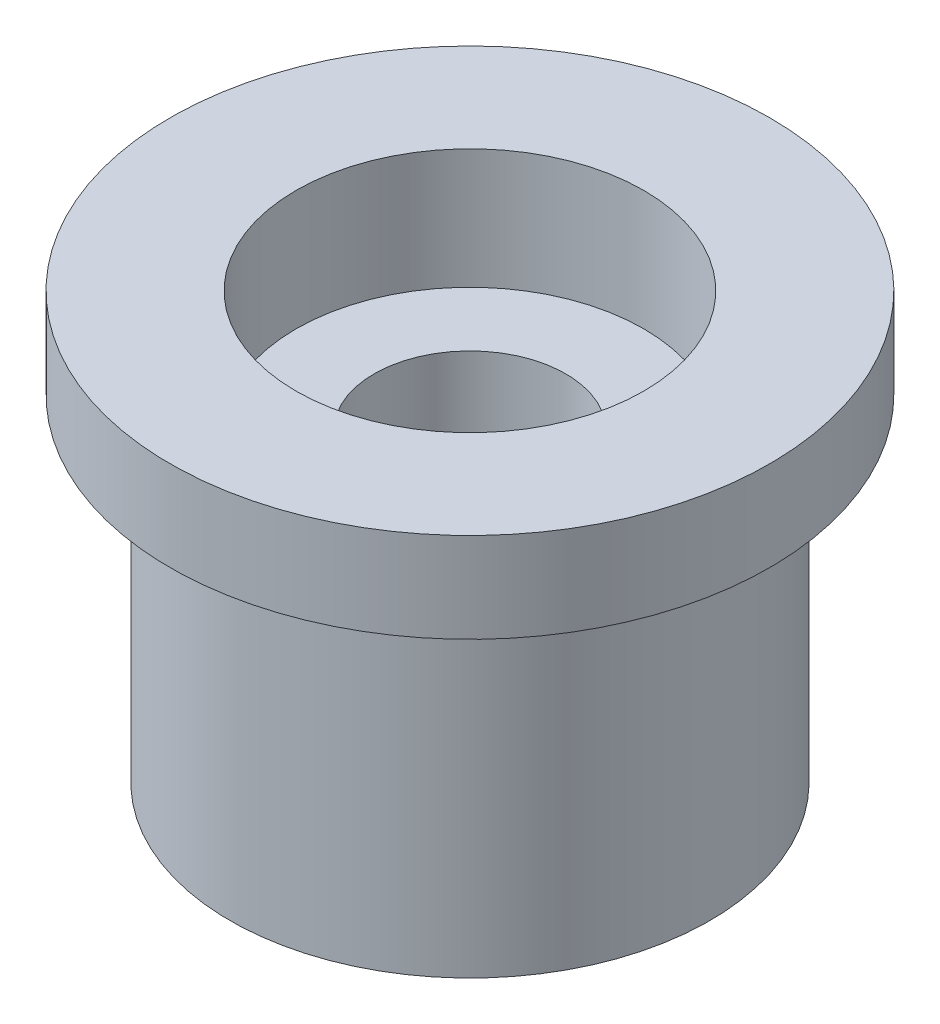
ISO-10303-21;
HEADER;
FILE_DESCRIPTION(('STEP AP214'),'2;1');
FILE_NAME('part.step','',(''),(''),'','','');
FILE_SCHEMA(('AUTOMOTIVE_DESIGN { 1 0 10303 214 1 1 1 1 }'));
ENDSEC;
DATA;
#1=APPLICATION_CONTEXT('core data for automotive mechanical design processes');
#2=APPLICATION_PROTOCOL_DEFINITION('international standard','automotive_design',2000,#1);
#3=PRODUCT_CONTEXT('',#1,'mechanical');
#4=PRODUCT('Part','Part','',(#3));
#5=PRODUCT_RELATED_PRODUCT_CATEGORY('part','',(#4));
#6=PRODUCT_DEFINITION_FORMATION('','',#4);
#7=PRODUCT_DEFINITION_CONTEXT('part definition',#1,'design');
#8=PRODUCT_DEFINITION('design','',#6,#7);
#9=PRODUCT_DEFINITION_SHAPE('','',#8);
#10=(LENGTH_UNIT() NAMED_UNIT(*) SI_UNIT(.MILLI.,.METRE.));
#11=(NAMED_UNIT(*) PLANE_ANGLE_UNIT() SI_UNIT($,.RADIAN.));
#12=(NAMED_UNIT(*) SI_UNIT($,.STERADIAN.) SOLID_ANGLE_UNIT());
#13=UNCERTAINTY_MEASURE_WITH_UNIT(LENGTH_MEASURE(1.E-05),#10,'distance_accuracy_value','');
#14=(GEOMETRIC_REPRESENTATION_CONTEXT(3) GLOBAL_UNCERTAINTY_ASSIGNED_CONTEXT((#13)) GLOBAL_UNIT_ASSIGNED_CONTEXT((#10,
#11,#12)) REPRESENTATION_CONTEXT('',''));
#15=CARTESIAN_POINT('',(0.,0.,0.));
#16=DIRECTION('',(0.,0.,1.));
#17=DIRECTION('',(1.,0.,0.));
#18=AXIS2_PLACEMENT_3D('',#15,#16,#17);
#19=CARTESIAN_POINT('',(0.,7.1,0.));
#20=DIRECTION('',(0.,-1.,0.));
#21=DIRECTION('',(0.,0.,-1.));
#22=AXIS2_PLACEMENT_3D('',#19,#20,#21);
#23=CYLINDRICAL_SURFACE('',#22,5.);
#24=CARTESIAN_POINT('',(0.,7.1,0.));
#25=DIRECTION('',(0.,-1.,0.));
#26=DIRECTION('',(0.,0.,-1.));
#27=AXIS2_PLACEMENT_3D('',#24,#25,#26);
#28=CIRCLE('',#27,5.);
#29=CARTESIAN_POINT('',(0.,7.1,-5.));
#30=VERTEX_POINT('',#29);
#31=EDGE_CURVE('E46',#30,#30,#28,.T.);
#32=ORIENTED_EDGE('',*,*,#31,.T.);
#33=EDGE_LOOP('',(#32));
#34=FACE_BOUND('',#33,.T.);
#35=CARTESIAN_POINT('',(0.,5.6,0.));
#36=DIRECTION('',(0.,-1.,0.));
#37=DIRECTION('',(0.,0.,-1.));
#38=AXIS2_PLACEMENT_3D('',#35,#36,#37);
#39=CIRCLE('',#38,5.);
#40=CARTESIAN_POINT('',(0.,5.6,-5.));
#41=VERTEX_POINT('',#40);
#42=EDGE_CURVE('E237',#41,#41,#39,.T.);
#43=ORIENTED_EDGE('',*,*,#42,.F.);
#44=EDGE_LOOP('',(#43));
#45=FACE_BOUND('',#44,.T.);
#46=ADVANCED_FACE('F43',(#34,#45),#23,.T.);
#47=CARTESIAN_POINT('',(5.,7.1,0.));
#48=DIRECTION('',(0.,1.,0.));
#49=DIRECTION('',(0.,0.,1.));
#50=AXIS2_PLACEMENT_3D('',#47,#48,#49);
#51=PLANE('',#50);
#52=CARTESIAN_POINT('',(0.,7.1,0.));
#53=DIRECTION('',(0.,1.,0.));
#54=DIRECTION('',(0.,0.,1.));
#55=AXIS2_PLACEMENT_3D('',#52,#53,#54);
#56=CIRCLE('',#55,2.9);
#57=CARTESIAN_POINT('',(0.,7.1,2.9));
#58=VERTEX_POINT('',#57);
#59=EDGE_CURVE('E337',#58,#58,#56,.T.);
#60=ORIENTED_EDGE('',*,*,#59,.F.);
#61=EDGE_LOOP('',(#60));
#62=FACE_BOUND('',#61,.T.);
#63=ORIENTED_EDGE('',*,*,#31,.F.);
#64=EDGE_LOOP('',(#63));
#65=FACE_BOUND('',#64,.T.);
#66=ADVANCED_FACE('F246',(#62,#65),#51,.T.);
#67=CARTESIAN_POINT('',(0.,5.6,0.));
#68=DIRECTION('',(0.,-1.,0.));
#69=DIRECTION('',(0.,0.,-1.));
#70=AXIS2_PLACEMENT_3D('',#67,#68,#69);
#71=PLANE('',#70);
#72=CARTESIAN_POINT('',(0.,5.6,0.));
#73=DIRECTION('',(0.,-1.,0.));
#74=DIRECTION('',(0.,0.,-1.));
#75=AXIS2_PLACEMENT_3D('',#72,#73,#74);
#76=CIRCLE('',#75,4.);
#77=CARTESIAN_POINT('',(0.,5.6,-4.));
#78=VERTEX_POINT('',#77);
#79=EDGE_CURVE('E11',#78,#78,#76,.T.);
#80=ORIENTED_EDGE('',*,*,#79,.F.);
#81=EDGE_LOOP('',(#80));
#82=FACE_BOUND('',#81,.T.);
#83=ORIENTED_EDGE('',*,*,#42,.T.);
#84=EDGE_LOOP('',(#83));
#85=FACE_BOUND('',#84,.T.);
#86=ADVANCED_FACE('F248',(#82,#85),#71,.T.);
#87=CARTESIAN_POINT('',(0.,0.,0.));
#88=DIRECTION('',(0.,1.,0.));
#89=DIRECTION('',(0.,0.,1.));
#90=AXIS2_PLACEMENT_3D('',#87,#88,#89);
#91=CYLINDRICAL_SURFACE('',#90,4.);
#92=CARTESIAN_POINT('',(0.,0.,0.));
#93=DIRECTION('',(0.,-1.,0.));
#94=DIRECTION('',(0.,0.,-1.));
#95=AXIS2_PLACEMENT_3D('',#92,#93,#94);
#96=CIRCLE('',#95,4.);
#97=CARTESIAN_POINT('',(0.,0.,-4.));
#98=VERTEX_POINT('',#97);
#99=EDGE_CURVE('E229',#98,#98,#96,.T.);
#100=ORIENTED_EDGE('',*,*,#99,.F.);
#101=EDGE_LOOP('',(#100));
#102=FACE_BOUND('',#101,.T.);
#103=ORIENTED_EDGE('',*,*,#79,.T.);
#104=EDGE_LOOP('',(#103));
#105=FACE_BOUND('',#104,.T.);
#106=ADVANCED_FACE('F254',(#102,#105),#91,.T.);
#107=CARTESIAN_POINT('',(0.,0.,0.));
#108=DIRECTION('',(0.,-1.,0.));
#109=DIRECTION('',(0.,0.,-1.));
#110=AXIS2_PLACEMENT_3D('',#107,#108,#109);
#111=PLANE('',#110);
#112=CARTESIAN_POINT('',(0.,0.,0.));
#113=DIRECTION('',(0.,1.,0.));
#114=DIRECTION('',(0.,0.,1.));
#115=AXIS2_PLACEMENT_3D('',#112,#113,#114);
#116=CIRCLE('',#115,1.60000000000001);
#117=CARTESIAN_POINT('',(0.,0.,1.60000000000001));
#118=VERTEX_POINT('',#117);
#119=EDGE_CURVE('E158',#118,#118,#116,.T.);
#120=ORIENTED_EDGE('',*,*,#119,.T.);
#121=EDGE_LOOP('',(#120));
#122=FACE_BOUND('',#121,.T.);
#123=CARTESIAN_POINT('',(-1.02515075142256E-13,0.,0.));
#124=DIRECTION('',(0.,-1.,0.));
#125=DIRECTION('',(0.,0.,-1.));
#126=AXIS2_PLACEMENT_3D('',#123,#124,#125);
#127=CIRCLE('',#126,3.09999999999998);
#128=CARTESIAN_POINT('',(-1.88345277640779,0.,2.46223590239489));
#129=VERTEX_POINT('',#128);
#130=CARTESIAN_POINT('',(-1.88345277640771,0.,-2.46223590239483));
#131=VERTEX_POINT('',#130);
#132=EDGE_CURVE('E58',#129,#131,#127,.T.);
#133=ORIENTED_EDGE('',*,*,#132,.F.);
#134=DIRECTION('',(-0.500000000000124,0.,0.866025403784367));
#135=VECTOR('',#134,1.);
#136=CARTESIAN_POINT('',(-1.47888532680438,0.,1.76150452459345));
#137=LINE('',#136,#135);
#138=CARTESIAN_POINT('',(-1.47888532680438,0.,1.76150452459345));
#139=VERTEX_POINT('',#138);
#140=EDGE_CURVE('E152',#139,#129,#137,.T.);
#141=ORIENTED_EDGE('',*,*,#140,.F.);
#142=CARTESIAN_POINT('',(-1.02515075142256E-13,0.,0.));
#143=DIRECTION('',(0.,1.,0.));
#144=DIRECTION('',(0.,0.,1.));
#145=AXIS2_PLACEMENT_3D('',#142,#143,#144);
#146=CIRCLE('',#145,2.3);
#147=CARTESIAN_POINT('',(-1.4788853268044,0.,-1.76150452459332));
#148=VERTEX_POINT('',#147);
#149=EDGE_CURVE('E155',#148,#139,#146,.T.);
#150=ORIENTED_EDGE('',*,*,#149,.F.);
#151=DIRECTION('',(0.5,0.,0.866025403784439));
#152=VECTOR('',#151,1.);
#153=CARTESIAN_POINT('',(-1.88345277640771,0.,-2.46223590239483));
#154=LINE('',#153,#152);
#155=EDGE_CURVE('E164',#131,#148,#154,.T.);
#156=ORIENTED_EDGE('',*,*,#155,.F.);
#157=EDGE_LOOP('',(#133,#141,#150,#156));
#158=FACE_BOUND('',#157,.T.);
#159=CARTESIAN_POINT('',(0.,0.,0.));
#160=DIRECTION('',(0.,1.,0.));
#161=DIRECTION('',(0.,0.,1.));
#162=AXIS2_PLACEMENT_3D('',#159,#160,#161);
#163=CIRCLE('',#162,2.3);
#164=CARTESIAN_POINT('',(2.26495033058122,0.,-0.400000000000019));
#165=VERTEX_POINT('',#164);
#166=CARTESIAN_POINT('',(-0.786065003776926,0.,-2.16150452459327));
#167=VERTEX_POINT('',#166);
#168=EDGE_CURVE('E66',#165,#167,#163,.T.);
#169=ORIENTED_EDGE('',*,*,#168,.F.);
#170=DIRECTION('',(-1.,0.,0.));
#171=VECTOR('',#170,1.);
#172=CARTESIAN_POINT('',(3.07408522978788,0.,-0.399999999999992));
#173=LINE('',#172,#171);
#174=CARTESIAN_POINT('',(3.07408522978788,0.,-0.399999999999993));
#175=VERTEX_POINT('',#174);
#176=EDGE_CURVE('E177',#175,#165,#173,.T.);
#177=ORIENTED_EDGE('',*,*,#176,.F.);
#178=CARTESIAN_POINT('',(0.,0.,0.));
#179=DIRECTION('',(0.,-1.,0.));
#180=DIRECTION('',(0.,0.,-1.));
#181=AXIS2_PLACEMENT_3D('',#178,#179,#180);
#182=CIRCLE('',#181,3.1);
#183=CARTESIAN_POINT('',(-1.19063245338013,0.,-2.86223590239484));
#184=VERTEX_POINT('',#183);
#185=EDGE_CURVE('E191',#184,#175,#182,.T.);
#186=ORIENTED_EDGE('',*,*,#185,.F.);
#187=DIRECTION('',(-0.499999999999857,0.,-0.866025403784521));
#188=VECTOR('',#187,1.);
#189=CARTESIAN_POINT('',(-0.786065003776927,0.,-2.16150452459327));
#190=LINE('',#189,#188);
#191=EDGE_CURVE('E188',#167,#184,#190,.T.);
#192=ORIENTED_EDGE('',*,*,#191,.F.);
#193=EDGE_LOOP('',(#169,#177,#186,#192));
#194=FACE_BOUND('',#193,.T.);
#195=CARTESIAN_POINT('',(0.,0.,0.));
#196=DIRECTION('',(0.,-1.,0.));
#197=DIRECTION('',(0.,0.,-1.));
#198=AXIS2_PLACEMENT_3D('',#195,#196,#197);
#199=CIRCLE('',#198,3.1);
#200=CARTESIAN_POINT('',(3.07408522978788,0.,0.399999999999992));
#201=VERTEX_POINT('',#200);
#202=CARTESIAN_POINT('',(-1.19063245337983,0.,2.86223590239497));
#203=VERTEX_POINT('',#202);
#204=EDGE_CURVE('E198',#201,#203,#199,.T.);
#205=ORIENTED_EDGE('',*,*,#204,.F.);
#206=DIRECTION('',(1.,0.,0.));
#207=VECTOR('',#206,1.);
#208=CARTESIAN_POINT('',(2.26495033058122,0.,0.400000000000019));
#209=LINE('',#208,#207);
#210=CARTESIAN_POINT('',(2.26495033058122,0.,0.40000000000002));
#211=VERTEX_POINT('',#210);
#212=EDGE_CURVE('E208',#211,#201,#209,.T.);
#213=ORIENTED_EDGE('',*,*,#212,.F.);
#214=CARTESIAN_POINT('',(0.,0.,0.));
#215=DIRECTION('',(0.,1.,0.));
#216=DIRECTION('',(0.,0.,1.));
#217=AXIS2_PLACEMENT_3D('',#214,#215,#216);
#218=CIRCLE('',#217,2.3);
#219=CARTESIAN_POINT('',(-0.786065003776618,0.,2.16150452459338));
#220=VERTEX_POINT('',#219);
#221=EDGE_CURVE('E222',#220,#211,#218,.T.);
#222=ORIENTED_EDGE('',*,*,#221,.F.);
#223=DIRECTION('',(0.499999999999856,0.,-0.866025403784522));
#224=VECTOR('',#223,1.);
#225=CARTESIAN_POINT('',(-1.19063245337983,0.,2.86223590239497));
#226=LINE('',#225,#224);
#227=EDGE_CURVE('E219',#203,#220,#226,.T.);
#228=ORIENTED_EDGE('',*,*,#227,.F.);
#229=EDGE_LOOP('',(#205,#213,#222,#228));
#230=FACE_BOUND('',#229,.T.);
#231=ORIENTED_EDGE('',*,*,#99,.T.);
#232=EDGE_LOOP('',(#231));
#233=FACE_BOUND('',#232,.T.);
#234=ADVANCED_FACE('F261',(#122,#158,#194,#230,#233),#111,.T.);
#235=CARTESIAN_POINT('',(0.,4.3,0.));
#236=DIRECTION('',(0.,-1.,0.));
#237=DIRECTION('',(0.,0.,-1.));
#238=AXIS2_PLACEMENT_3D('',#235,#236,#237);
#239=CYLINDRICAL_SURFACE('',#238,3.1);
#240=ORIENTED_EDGE('',*,*,#204,.T.);
#241=DIRECTION('',(0.,-1.,0.));
#242=VECTOR('',#241,1.);
#243=CARTESIAN_POINT('',(-1.19063245337983,4.3,2.86223590239497));
#244=LINE('',#243,#242);
#245=CARTESIAN_POINT('',(-1.19063245337983,4.3,2.86223590239497));
#246=VERTEX_POINT('',#245);
#247=EDGE_CURVE('E217',#246,#203,#244,.T.);
#248=ORIENTED_EDGE('',*,*,#247,.F.);
#249=CARTESIAN_POINT('',(0.,4.3,0.));
#250=DIRECTION('',(0.,-1.,0.));
#251=DIRECTION('',(0.,0.,-1.));
#252=AXIS2_PLACEMENT_3D('',#249,#250,#251);
#253=CIRCLE('',#252,3.1);
#254=CARTESIAN_POINT('',(3.07408522978788,4.3,0.399999999999992));
#255=VERTEX_POINT('',#254);
#256=EDGE_CURVE('E204',#255,#246,#253,.T.);
#257=ORIENTED_EDGE('',*,*,#256,.F.);
#258=DIRECTION('',(0.,-1.,0.));
#259=VECTOR('',#258,1.);
#260=CARTESIAN_POINT('',(3.07408522978788,4.3,0.399999999999992));
#261=LINE('',#260,#259);
#262=EDGE_CURVE('E227',#255,#201,#261,.T.);
#263=ORIENTED_EDGE('',*,*,#262,.T.);
#264=EDGE_LOOP('',(#240,#248,#257,#263));
#265=FACE_BOUND('',#264,.T.);
#266=ADVANCED_FACE('F265',(#265),#239,.F.);
#267=CARTESIAN_POINT('',(2.26495033058122,4.3,0.400000000000019));
#268=DIRECTION('',(0.,0.,-1.));
#269=DIRECTION('',(-1.,0.,0.));
#270=AXIS2_PLACEMENT_3D('',#267,#268,#269);
#271=PLANE('',#270);
#272=ORIENTED_EDGE('',*,*,#212,.T.);
#273=ORIENTED_EDGE('',*,*,#262,.F.);
#274=DIRECTION('',(1.,0.,0.));
#275=VECTOR('',#274,1.);
#276=CARTESIAN_POINT('',(2.26495033058122,4.3,0.400000000000019));
#277=LINE('',#276,#275);
#278=CARTESIAN_POINT('',(2.26495033058122,4.3,0.40000000000002));
#279=VERTEX_POINT('',#278);
#280=EDGE_CURVE('E214',#279,#255,#277,.T.);
#281=ORIENTED_EDGE('',*,*,#280,.F.);
#282=DIRECTION('',(0.,-1.,0.));
#283=VECTOR('',#282,1.);
#284=CARTESIAN_POINT('',(2.26495033058122,4.3,0.40000000000002));
#285=LINE('',#284,#283);
#286=EDGE_CURVE('E230',#279,#211,#285,.T.);
#287=ORIENTED_EDGE('',*,*,#286,.T.);
#288=EDGE_LOOP('',(#272,#273,#281,#287));
#289=FACE_BOUND('',#288,.T.);
#290=ADVANCED_FACE('F269',(#289),#271,.F.);
#291=CARTESIAN_POINT('',(0.,4.3,0.));
#292=DIRECTION('',(0.,-1.,0.));
#293=DIRECTION('',(0.,0.,-1.));
#294=AXIS2_PLACEMENT_3D('',#291,#292,#293);
#295=CYLINDRICAL_SURFACE('',#294,2.3);
#296=ORIENTED_EDGE('',*,*,#221,.T.);
#297=ORIENTED_EDGE('',*,*,#286,.F.);
#298=CARTESIAN_POINT('',(0.,4.3,0.));
#299=DIRECTION('',(0.,1.,0.));
#300=DIRECTION('',(0.,0.,1.));
#301=AXIS2_PLACEMENT_3D('',#298,#299,#300);
#302=CIRCLE('',#301,2.3);
#303=CARTESIAN_POINT('',(-0.786065003776618,4.3,2.16150452459338));
#304=VERTEX_POINT('',#303);
#305=EDGE_CURVE('E211',#304,#279,#302,.T.);
#306=ORIENTED_EDGE('',*,*,#305,.F.);
#307=DIRECTION('',(0.,-1.,0.));
#308=VECTOR('',#307,1.);
#309=CARTESIAN_POINT('',(-0.786065003776618,4.3,2.16150452459338));
#310=LINE('',#309,#308);
#311=EDGE_CURVE('E232',#304,#220,#310,.T.);
#312=ORIENTED_EDGE('',*,*,#311,.T.);
#313=EDGE_LOOP('',(#296,#297,#306,#312));
#314=FACE_BOUND('',#313,.T.);
#315=ADVANCED_FACE('F275',(#314),#295,.T.);
#316=CARTESIAN_POINT('',(-1.19063245337983,4.3,2.86223590239497));
#317=DIRECTION('',(-0.866025403784522,0.,-0.499999999999856));
#318=DIRECTION('',(-0.499999999999856,0.,0.866025403784522));
#319=AXIS2_PLACEMENT_3D('',#316,#317,#318);
#320=PLANE('',#319);
#321=ORIENTED_EDGE('',*,*,#227,.T.);
#322=ORIENTED_EDGE('',*,*,#311,.F.);
#323=DIRECTION('',(0.499999999999856,0.,-0.866025403784522));
#324=VECTOR('',#323,1.);
#325=CARTESIAN_POINT('',(-1.19063245337983,4.3,2.86223590239497));
#326=LINE('',#325,#324);
#327=EDGE_CURVE('E207',#246,#304,#326,.T.);
#328=ORIENTED_EDGE('',*,*,#327,.F.);
#329=ORIENTED_EDGE('',*,*,#247,.T.);
#330=EDGE_LOOP('',(#321,#322,#328,#329));
#331=FACE_BOUND('',#330,.T.);
#332=ADVANCED_FACE('F271',(#331),#320,.F.);
#333=CARTESIAN_POINT('',(0.,4.3,0.));
#334=DIRECTION('',(0.,-1.,0.));
#335=DIRECTION('',(0.,0.,-1.));
#336=AXIS2_PLACEMENT_3D('',#333,#334,#335);
#337=PLANE('',#336);
#338=ORIENTED_EDGE('',*,*,#256,.T.);
#339=ORIENTED_EDGE('',*,*,#327,.T.);
#340=ORIENTED_EDGE('',*,*,#305,.T.);
#341=ORIENTED_EDGE('',*,*,#280,.T.);
#342=EDGE_LOOP('',(#338,#339,#340,#341));
#343=FACE_BOUND('',#342,.T.);
#344=ADVANCED_FACE('F274',(#343),#337,.T.);
#345=CARTESIAN_POINT('',(0.,4.3,0.));
#346=DIRECTION('',(0.,-1.,0.));
#347=DIRECTION('',(0.,0.,-1.));
#348=AXIS2_PLACEMENT_3D('',#345,#346,#347);
#349=CYLINDRICAL_SURFACE('',#348,2.3);
#350=ORIENTED_EDGE('',*,*,#168,.T.);
#351=DIRECTION('',(0.,-1.,0.));
#352=VECTOR('',#351,1.);
#353=CARTESIAN_POINT('',(-0.786065003776927,4.3,-2.16150452459327));
#354=LINE('',#353,#352);
#355=CARTESIAN_POINT('',(-0.786065003776927,4.3,-2.16150452459327));
#356=VERTEX_POINT('',#355);
#357=EDGE_CURVE('E186',#356,#167,#354,.T.);
#358=ORIENTED_EDGE('',*,*,#357,.F.);
#359=CARTESIAN_POINT('',(0.,4.3,0.));
#360=DIRECTION('',(0.,1.,0.));
#361=DIRECTION('',(0.,0.,1.));
#362=AXIS2_PLACEMENT_3D('',#359,#360,#361);
#363=CIRCLE('',#362,2.3);
#364=CARTESIAN_POINT('',(2.26495033058122,4.3,-0.400000000000019));
#365=VERTEX_POINT('',#364);
#366=EDGE_CURVE('E173',#365,#356,#363,.T.);
#367=ORIENTED_EDGE('',*,*,#366,.F.);
#368=DIRECTION('',(0.,-1.,0.));
#369=VECTOR('',#368,1.);
#370=CARTESIAN_POINT('',(2.26495033058122,4.3,-0.400000000000019));
#371=LINE('',#370,#369);
#372=EDGE_CURVE('E196',#365,#165,#371,.T.);
#373=ORIENTED_EDGE('',*,*,#372,.T.);
#374=EDGE_LOOP('',(#350,#358,#367,#373));
#375=FACE_BOUND('',#374,.T.);
#376=ADVANCED_FACE('F285',(#375),#349,.T.);
#377=CARTESIAN_POINT('',(3.07408522978788,4.3,-0.399999999999992));
#378=DIRECTION('',(0.,0.,1.));
#379=DIRECTION('',(1.,0.,0.));
#380=AXIS2_PLACEMENT_3D('',#377,#378,#379);
#381=PLANE('',#380);
#382=ORIENTED_EDGE('',*,*,#176,.T.);
#383=ORIENTED_EDGE('',*,*,#372,.F.);
#384=DIRECTION('',(-1.,0.,0.));
#385=VECTOR('',#384,1.);
#386=CARTESIAN_POINT('',(3.07408522978788,4.3,-0.399999999999992));
#387=LINE('',#386,#385);
#388=CARTESIAN_POINT('',(3.07408522978788,4.3,-0.399999999999993));
#389=VERTEX_POINT('',#388);
#390=EDGE_CURVE('E183',#389,#365,#387,.T.);
#391=ORIENTED_EDGE('',*,*,#390,.F.);
#392=DIRECTION('',(0.,-1.,0.));
#393=VECTOR('',#392,1.);
#394=CARTESIAN_POINT('',(3.07408522978788,4.3,-0.399999999999993));
#395=LINE('',#394,#393);
#396=EDGE_CURVE('E199',#389,#175,#395,.T.);
#397=ORIENTED_EDGE('',*,*,#396,.T.);
#398=EDGE_LOOP('',(#382,#383,#391,#397));
#399=FACE_BOUND('',#398,.T.);
#400=ADVANCED_FACE('F289',(#399),#381,.F.);
#401=CARTESIAN_POINT('',(0.,4.3,0.));
#402=DIRECTION('',(0.,-1.,0.));
#403=DIRECTION('',(0.,0.,-1.));
#404=AXIS2_PLACEMENT_3D('',#401,#402,#403);
#405=CYLINDRICAL_SURFACE('',#404,3.1);
#406=ORIENTED_EDGE('',*,*,#185,.T.);
#407=ORIENTED_EDGE('',*,*,#396,.F.);
#408=CARTESIAN_POINT('',(0.,4.3,0.));
#409=DIRECTION('',(0.,-1.,0.));
#410=DIRECTION('',(0.,0.,-1.));
#411=AXIS2_PLACEMENT_3D('',#408,#409,#410);
#412=CIRCLE('',#411,3.1);
#413=CARTESIAN_POINT('',(-1.19063245338013,4.3,-2.86223590239484));
#414=VERTEX_POINT('',#413);
#415=EDGE_CURVE('E180',#414,#389,#412,.T.);
#416=ORIENTED_EDGE('',*,*,#415,.F.);
#417=DIRECTION('',(0.,-1.,0.));
#418=VECTOR('',#417,1.);
#419=CARTESIAN_POINT('',(-1.19063245338013,4.3,-2.86223590239484));
#420=LINE('',#419,#418);
#421=EDGE_CURVE('E201',#414,#184,#420,.T.);
#422=ORIENTED_EDGE('',*,*,#421,.T.);
#423=EDGE_LOOP('',(#406,#407,#416,#422));
#424=FACE_BOUND('',#423,.T.);
#425=ADVANCED_FACE('F294',(#424),#405,.F.);
#426=CARTESIAN_POINT('',(-0.786065003776927,4.3,-2.16150452459327));
#427=DIRECTION('',(-0.866025403784521,0.,0.499999999999857));
#428=DIRECTION('',(0.499999999999857,0.,0.866025403784521));
#429=AXIS2_PLACEMENT_3D('',#426,#427,#428);
#430=PLANE('',#429);
#431=ORIENTED_EDGE('',*,*,#191,.T.);
#432=ORIENTED_EDGE('',*,*,#421,.F.);
#433=DIRECTION('',(-0.499999999999857,0.,-0.866025403784521));
#434=VECTOR('',#433,1.);
#435=CARTESIAN_POINT('',(-0.786065003776927,4.3,-2.16150452459327));
#436=LINE('',#435,#434);
#437=EDGE_CURVE('E176',#356,#414,#436,.T.);
#438=ORIENTED_EDGE('',*,*,#437,.F.);
#439=ORIENTED_EDGE('',*,*,#357,.T.);
#440=EDGE_LOOP('',(#431,#432,#438,#439));
#441=FACE_BOUND('',#440,.T.);
#442=ADVANCED_FACE('F290',(#441),#430,.F.);
#443=CARTESIAN_POINT('',(0.,4.3,0.));
#444=DIRECTION('',(0.,1.,0.));
#445=DIRECTION('',(0.,0.,1.));
#446=AXIS2_PLACEMENT_3D('',#443,#444,#445);
#447=PLANE('',#446);
#448=ORIENTED_EDGE('',*,*,#366,.T.);
#449=ORIENTED_EDGE('',*,*,#437,.T.);
#450=ORIENTED_EDGE('',*,*,#415,.T.);
#451=ORIENTED_EDGE('',*,*,#390,.T.);
#452=EDGE_LOOP('',(#448,#449,#450,#451));
#453=FACE_BOUND('',#452,.T.);
#454=ADVANCED_FACE('F293',(#453),#447,.F.);
#455=CARTESIAN_POINT('',(-1.02515075142256E-13,4.3,0.));
#456=DIRECTION('',(0.,-1.,0.));
#457=DIRECTION('',(0.,0.,-1.));
#458=AXIS2_PLACEMENT_3D('',#455,#456,#457);
#459=CYLINDRICAL_SURFACE('',#458,3.09999999999998);
#460=ORIENTED_EDGE('',*,*,#132,.T.);
#461=DIRECTION('',(0.,-1.,0.));
#462=VECTOR('',#461,1.);
#463=CARTESIAN_POINT('',(-1.88345277640771,4.3,-2.46223590239483));
#464=LINE('',#463,#462);
#465=CARTESIAN_POINT('',(-1.88345277640771,4.3,-2.46223590239483));
#466=VERTEX_POINT('',#465);
#467=EDGE_CURVE('E130',#466,#131,#464,.T.);
#468=ORIENTED_EDGE('',*,*,#467,.F.);
#469=CARTESIAN_POINT('',(-1.02515075142256E-13,4.3,0.));
#470=DIRECTION('',(0.,-1.,0.));
#471=DIRECTION('',(0.,0.,-1.));
#472=AXIS2_PLACEMENT_3D('',#469,#470,#471);
#473=CIRCLE('',#472,3.09999999999998);
#474=CARTESIAN_POINT('',(-1.88345277640779,4.3,2.46223590239489));
#475=VERTEX_POINT('',#474);
#476=EDGE_CURVE('E134',#475,#466,#473,.T.);
#477=ORIENTED_EDGE('',*,*,#476,.F.);
#478=DIRECTION('',(0.,-1.,0.));
#479=VECTOR('',#478,1.);
#480=CARTESIAN_POINT('',(-1.88345277640779,4.3,2.46223590239489));
#481=LINE('',#480,#479);
#482=EDGE_CURVE('E168',#475,#129,#481,.T.);
#483=ORIENTED_EDGE('',*,*,#482,.T.);
#484=EDGE_LOOP('',(#460,#468,#477,#483));
#485=FACE_BOUND('',#484,.T.);
#486=ADVANCED_FACE('F132',(#485),#459,.F.);
#487=CARTESIAN_POINT('',(-1.47888532680438,4.3,1.76150452459345));
#488=DIRECTION('',(0.866025403784367,0.,0.500000000000124));
#489=DIRECTION('',(0.500000000000124,0.,-0.866025403784367));
#490=AXIS2_PLACEMENT_3D('',#487,#488,#489);
#491=PLANE('',#490);
#492=ORIENTED_EDGE('',*,*,#140,.T.);
#493=ORIENTED_EDGE('',*,*,#482,.F.);
#494=DIRECTION('',(-0.500000000000124,0.,0.866025403784367));
#495=VECTOR('',#494,1.);
#496=CARTESIAN_POINT('',(-1.47888532680438,4.3,1.76150452459345));
#497=LINE('',#496,#495);
#498=CARTESIAN_POINT('',(-1.47888532680438,4.3,1.76150452459345));
#499=VERTEX_POINT('',#498);
#500=EDGE_CURVE('E140',#499,#475,#497,.T.);
#501=ORIENTED_EDGE('',*,*,#500,.F.);
#502=DIRECTION('',(0.,-1.,0.));
#503=VECTOR('',#502,1.);
#504=CARTESIAN_POINT('',(-1.47888532680438,4.3,1.76150452459345));
#505=LINE('',#504,#503);
#506=EDGE_CURVE('E170',#499,#139,#505,.T.);
#507=ORIENTED_EDGE('',*,*,#506,.T.);
#508=EDGE_LOOP('',(#492,#493,#501,#507));
#509=FACE_BOUND('',#508,.T.);
#510=ADVANCED_FACE('F307',(#509),#491,.F.);
#511=CARTESIAN_POINT('',(-1.02515075142256E-13,4.3,0.));
#512=DIRECTION('',(0.,-1.,0.));
#513=DIRECTION('',(0.,0.,-1.));
#514=AXIS2_PLACEMENT_3D('',#511,#512,#513);
#515=CYLINDRICAL_SURFACE('',#514,2.3);
#516=ORIENTED_EDGE('',*,*,#149,.T.);
#517=ORIENTED_EDGE('',*,*,#506,.F.);
#518=CARTESIAN_POINT('',(-1.02515075142256E-13,4.3,0.));
#519=DIRECTION('',(0.,1.,0.));
#520=DIRECTION('',(0.,0.,1.));
#521=AXIS2_PLACEMENT_3D('',#518,#519,#520);
#522=CIRCLE('',#521,2.3);
#523=CARTESIAN_POINT('',(-1.4788853268044,4.3,-1.76150452459332));
#524=VERTEX_POINT('',#523);
#525=EDGE_CURVE('E148',#524,#499,#522,.T.);
#526=ORIENTED_EDGE('',*,*,#525,.F.);
#527=DIRECTION('',(0.,-1.,0.));
#528=VECTOR('',#527,1.);
#529=CARTESIAN_POINT('',(-1.4788853268044,4.3,-1.76150452459332));
#530=LINE('',#529,#528);
#531=EDGE_CURVE('E139',#524,#148,#530,.T.);
#532=ORIENTED_EDGE('',*,*,#531,.T.);
#533=EDGE_LOOP('',(#516,#517,#526,#532));
#534=FACE_BOUND('',#533,.T.);
#535=ADVANCED_FACE('F310',(#534),#515,.T.);
#536=CARTESIAN_POINT('',(-1.88345277640771,4.3,-2.46223590239483));
#537=DIRECTION('',(0.866025403784438,0.,-0.5));
#538=DIRECTION('',(-0.5,0.,-0.866025403784439));
#539=AXIS2_PLACEMENT_3D('',#536,#537,#538);
#540=PLANE('',#539);
#541=ORIENTED_EDGE('',*,*,#155,.T.);
#542=ORIENTED_EDGE('',*,*,#531,.F.);
#543=DIRECTION('',(0.5,0.,0.866025403784439));
#544=VECTOR('',#543,1.);
#545=CARTESIAN_POINT('',(-1.88345277640771,4.3,-2.46223590239483));
#546=LINE('',#545,#544);
#547=EDGE_CURVE('E143',#466,#524,#546,.T.);
#548=ORIENTED_EDGE('',*,*,#547,.F.);
#549=ORIENTED_EDGE('',*,*,#467,.T.);
#550=EDGE_LOOP('',(#541,#542,#548,#549));
#551=FACE_BOUND('',#550,.T.);
#552=ADVANCED_FACE('F144',(#551),#540,.F.);
#553=CARTESIAN_POINT('',(-1.02515075142256E-13,4.3,0.));
#554=DIRECTION('',(0.,-1.,0.));
#555=DIRECTION('',(0.,0.,-1.));
#556=AXIS2_PLACEMENT_3D('',#553,#554,#555);
#557=PLANE('',#556);
#558=ORIENTED_EDGE('',*,*,#476,.T.);
#559=ORIENTED_EDGE('',*,*,#547,.T.);
#560=ORIENTED_EDGE('',*,*,#525,.T.);
#561=ORIENTED_EDGE('',*,*,#500,.T.);
#562=EDGE_LOOP('',(#558,#559,#560,#561));
#563=FACE_BOUND('',#562,.T.);
#564=ADVANCED_FACE('F150',(#563),#557,.T.);
#565=CARTESIAN_POINT('',(0.,7.1,0.));
#566=DIRECTION('',(0.,1.,0.));
#567=DIRECTION('',(0.,0.,1.));
#568=AXIS2_PLACEMENT_3D('',#565,#566,#567);
#569=CYLINDRICAL_SURFACE('',#568,1.60000000000001);
#570=ORIENTED_EDGE('',*,*,#119,.F.);
#571=EDGE_LOOP('',(#570));
#572=FACE_BOUND('',#571,.T.);
#573=CARTESIAN_POINT('',(0.,5.1,0.));
#574=DIRECTION('',(0.,1.,0.));
#575=DIRECTION('',(0.,0.,1.));
#576=AXIS2_PLACEMENT_3D('',#573,#574,#575);
#577=CIRCLE('',#576,1.60000000000001);
#578=CARTESIAN_POINT('',(0.,5.1,1.60000000000001));
#579=VERTEX_POINT('',#578);
#580=EDGE_CURVE('E339',#579,#579,#577,.T.);
#581=ORIENTED_EDGE('',*,*,#580,.T.);
#582=EDGE_LOOP('',(#581));
#583=FACE_BOUND('',#582,.T.);
#584=ADVANCED_FACE('F319',(#572,#583),#569,.F.);
#585=CARTESIAN_POINT('',(1.60000000000001,5.1,0.));
#586=DIRECTION('',(0.,-1.,0.));
#587=DIRECTION('',(0.,0.,-1.));
#588=AXIS2_PLACEMENT_3D('',#585,#586,#587);
#589=PLANE('',#588);
#590=ORIENTED_EDGE('',*,*,#580,.F.);
#591=EDGE_LOOP('',(#590));
#592=FACE_BOUND('',#591,.T.);
#593=CARTESIAN_POINT('',(0.,5.1,0.));
#594=DIRECTION('',(0.,1.,0.));
#595=DIRECTION('',(0.,0.,1.));
#596=AXIS2_PLACEMENT_3D('',#593,#594,#595);
#597=CIRCLE('',#596,2.9);
#598=CARTESIAN_POINT('',(0.,5.1,2.9));
#599=VERTEX_POINT('',#598);
#600=EDGE_CURVE('E335',#599,#599,#597,.T.);
#601=ORIENTED_EDGE('',*,*,#600,.T.);
#602=EDGE_LOOP('',(#601));
#603=FACE_BOUND('',#602,.T.);
#604=ADVANCED_FACE('F322',(#592,#603),#589,.F.);
#605=CARTESIAN_POINT('',(0.,7.1,0.));
#606=DIRECTION('',(0.,1.,0.));
#607=DIRECTION('',(0.,0.,1.));
#608=AXIS2_PLACEMENT_3D('',#605,#606,#607);
#609=CYLINDRICAL_SURFACE('',#608,2.9);
#610=ORIENTED_EDGE('',*,*,#600,.F.);
#611=EDGE_LOOP('',(#610));
#612=FACE_BOUND('',#611,.T.);
#613=ORIENTED_EDGE('',*,*,#59,.T.);
#614=EDGE_LOOP('',(#613));
#615=FACE_BOUND('',#614,.T.);
#616=ADVANCED_FACE('F326',(#612,#615),#609,.F.);
#617=CLOSED_SHELL('',(#46,#66,#86,#106,#234,#266,#290,#315,#332,#344,#376,#400,#425,#442,#454,
#486,#510,#535,#552,#564,#584,#604,#616));
#618=MANIFOLD_SOLID_BREP('B2',#617);
#619=ADVANCED_BREP_SHAPE_REPRESENTATION('',(#18,#618),#14);
#620=SHAPE_DEFINITION_REPRESENTATION(#9,#619);
ENDSEC;
END-ISO-10303-21;
